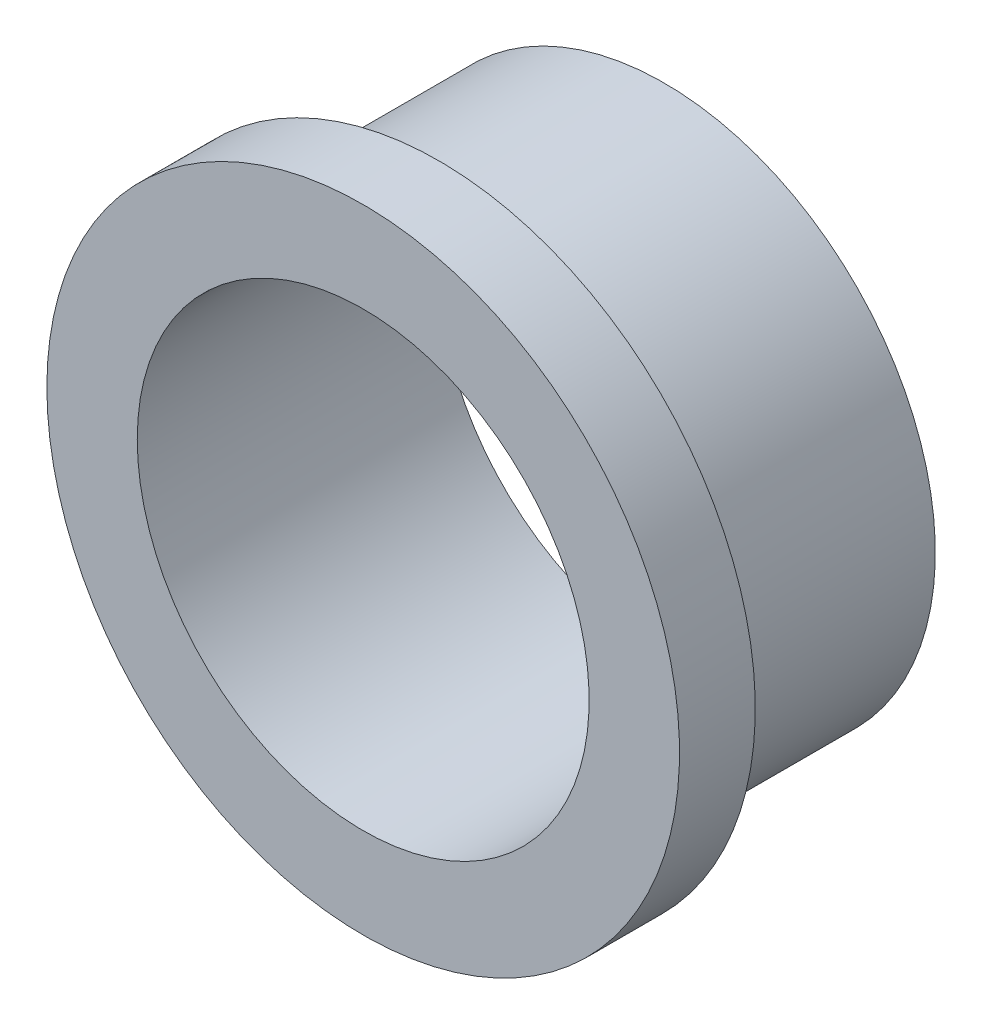
ISO-10303-21;
HEADER;
FILE_DESCRIPTION(('STEP AP214'),'2;1');
FILE_NAME('part.step','',(''),(''),'','','');
FILE_SCHEMA(('AUTOMOTIVE_DESIGN { 1 0 10303 214 1 1 1 1 }'));
ENDSEC;
DATA;
#1=APPLICATION_CONTEXT('core data for automotive mechanical design processes');
#2=APPLICATION_PROTOCOL_DEFINITION('international standard','automotive_design',2000,#1);
#3=PRODUCT_CONTEXT('',#1,'mechanical');
#4=PRODUCT('Part','Part','',(#3));
#5=PRODUCT_RELATED_PRODUCT_CATEGORY('part','',(#4));
#6=PRODUCT_DEFINITION_FORMATION('','',#4);
#7=PRODUCT_DEFINITION_CONTEXT('part definition',#1,'design');
#8=PRODUCT_DEFINITION('design','',#6,#7);
#9=PRODUCT_DEFINITION_SHAPE('','',#8);
#10=(LENGTH_UNIT() NAMED_UNIT(*) SI_UNIT(.MILLI.,.METRE.));
#11=(NAMED_UNIT(*) PLANE_ANGLE_UNIT() SI_UNIT($,.RADIAN.));
#12=(NAMED_UNIT(*) SI_UNIT($,.STERADIAN.) SOLID_ANGLE_UNIT());
#13=UNCERTAINTY_MEASURE_WITH_UNIT(LENGTH_MEASURE(1.E-05),#10,'distance_accuracy_value','');
#14=(GEOMETRIC_REPRESENTATION_CONTEXT(3) GLOBAL_UNCERTAINTY_ASSIGNED_CONTEXT((#13)) GLOBAL_UNIT_ASSIGNED_CONTEXT((#10,
#11,#12)) REPRESENTATION_CONTEXT('',''));
#15=CARTESIAN_POINT('',(0.,0.,0.));
#16=DIRECTION('',(0.,0.,1.));
#17=DIRECTION('',(1.,0.,0.));
#18=AXIS2_PLACEMENT_3D('',#15,#16,#17);
#19=CARTESIAN_POINT('',(0.,0.,0.));
#20=DIRECTION('',(0.,0.,-1.));
#21=DIRECTION('',(-1.,0.,0.));
#22=AXIS2_PLACEMENT_3D('',#19,#20,#21);
#23=CYLINDRICAL_SURFACE('',#22,3.5);
#24=CARTESIAN_POINT('',(0.,0.,-0.8382));
#25=DIRECTION('',(0.,0.,-1.));
#26=DIRECTION('',(-1.,0.,0.));
#27=AXIS2_PLACEMENT_3D('',#24,#25,#26);
#28=CIRCLE('',#27,3.5);
#29=CARTESIAN_POINT('',(-3.5,0.,-0.8382));
#30=VERTEX_POINT('',#29);
#31=EDGE_CURVE('E11',#30,#30,#28,.T.);
#32=ORIENTED_EDGE('',*,*,#31,.F.);
#33=EDGE_LOOP('',(#32));
#34=FACE_BOUND('',#33,.T.);
#35=CARTESIAN_POINT('',(0.,0.,0.));
#36=DIRECTION('',(0.,0.,-1.));
#37=DIRECTION('',(-1.,0.,0.));
#38=AXIS2_PLACEMENT_3D('',#35,#36,#37);
#39=CIRCLE('',#38,3.5);
#40=CARTESIAN_POINT('',(-3.5,0.,0.));
#41=VERTEX_POINT('',#40);
#42=EDGE_CURVE('E62',#41,#41,#39,.T.);
#43=ORIENTED_EDGE('',*,*,#42,.T.);
#44=EDGE_LOOP('',(#43));
#45=FACE_BOUND('',#44,.T.);
#46=ADVANCED_FACE('F17',(#34,#45),#23,.T.);
#47=CARTESIAN_POINT('',(0.,3.,-0.8382));
#48=DIRECTION('',(0.,0.,-1.));
#49=DIRECTION('',(0.,-1.,0.));
#50=AXIS2_PLACEMENT_3D('',#47,#48,#49);
#51=PLANE('',#50);
#52=CARTESIAN_POINT('',(0.,0.,-0.8382));
#53=DIRECTION('',(0.,0.,-1.));
#54=DIRECTION('',(-1.,0.,0.));
#55=AXIS2_PLACEMENT_3D('',#52,#53,#54);
#56=CIRCLE('',#55,3.);
#57=CARTESIAN_POINT('',(-3.,0.,-0.8382));
#58=VERTEX_POINT('',#57);
#59=EDGE_CURVE('E26',#58,#58,#56,.T.);
#60=ORIENTED_EDGE('',*,*,#59,.F.);
#61=EDGE_LOOP('',(#60));
#62=FACE_BOUND('',#61,.T.);
#63=ORIENTED_EDGE('',*,*,#31,.T.);
#64=EDGE_LOOP('',(#63));
#65=FACE_BOUND('',#64,.T.);
#66=ADVANCED_FACE('F131',(#62,#65),#51,.T.);
#67=CARTESIAN_POINT('',(0.,0.,0.));
#68=DIRECTION('',(0.,0.,-1.));
#69=DIRECTION('',(-1.,0.,0.));
#70=AXIS2_PLACEMENT_3D('',#67,#68,#69);
#71=CYLINDRICAL_SURFACE('',#70,3.);
#72=CARTESIAN_POINT('',(0.,0.,-3.33));
#73=DIRECTION('',(0.,0.,-1.));
#74=DIRECTION('',(-1.,0.,0.));
#75=AXIS2_PLACEMENT_3D('',#72,#73,#74);
#76=CIRCLE('',#75,3.);
#77=CARTESIAN_POINT('',(-3.,0.,-3.33));
#78=VERTEX_POINT('',#77);
#79=EDGE_CURVE('E71',#78,#78,#76,.T.);
#80=ORIENTED_EDGE('',*,*,#79,.F.);
#81=EDGE_LOOP('',(#80));
#82=FACE_BOUND('',#81,.T.);
#83=ORIENTED_EDGE('',*,*,#59,.T.);
#84=EDGE_LOOP('',(#83));
#85=FACE_BOUND('',#84,.T.);
#86=ADVANCED_FACE('F123',(#82,#85),#71,.T.);
#87=CARTESIAN_POINT('',(0.,2.5,-3.33));
#88=DIRECTION('',(0.,0.,-1.));
#89=DIRECTION('',(0.,-1.,0.));
#90=AXIS2_PLACEMENT_3D('',#87,#88,#89);
#91=PLANE('',#90);
#92=CARTESIAN_POINT('',(0.,0.,-3.33));
#93=DIRECTION('',(0.,0.,-1.));
#94=DIRECTION('',(-1.,0.,0.));
#95=AXIS2_PLACEMENT_3D('',#92,#93,#94);
#96=CIRCLE('',#95,2.5);
#97=CARTESIAN_POINT('',(-2.5,0.,-3.33));
#98=VERTEX_POINT('',#97);
#99=EDGE_CURVE('E67',#98,#98,#96,.T.);
#100=ORIENTED_EDGE('',*,*,#99,.F.);
#101=EDGE_LOOP('',(#100));
#102=FACE_BOUND('',#101,.T.);
#103=ORIENTED_EDGE('',*,*,#79,.T.);
#104=EDGE_LOOP('',(#103));
#105=FACE_BOUND('',#104,.T.);
#106=ADVANCED_FACE('F112',(#102,#105),#91,.T.);
#107=CARTESIAN_POINT('',(0.,0.,0.));
#108=DIRECTION('',(0.,0.,-1.));
#109=DIRECTION('',(-1.,0.,0.));
#110=AXIS2_PLACEMENT_3D('',#107,#108,#109);
#111=CYLINDRICAL_SURFACE('',#110,2.5);
#112=CARTESIAN_POINT('',(0.,0.,0.));
#113=DIRECTION('',(0.,0.,-1.));
#114=DIRECTION('',(-1.,0.,0.));
#115=AXIS2_PLACEMENT_3D('',#112,#113,#114);
#116=CIRCLE('',#115,2.5);
#117=CARTESIAN_POINT('',(-2.5,0.,0.));
#118=VERTEX_POINT('',#117);
#119=EDGE_CURVE('E55',#118,#118,#116,.T.);
#120=ORIENTED_EDGE('',*,*,#119,.F.);
#121=EDGE_LOOP('',(#120));
#122=FACE_BOUND('',#121,.T.);
#123=ORIENTED_EDGE('',*,*,#99,.T.);
#124=EDGE_LOOP('',(#123));
#125=FACE_BOUND('',#124,.T.);
#126=ADVANCED_FACE('F68',(#122,#125),#111,.F.);
#127=CARTESIAN_POINT('',(0.,3.5,0.));
#128=DIRECTION('',(0.,0.,1.));
#129=DIRECTION('',(1.,0.,0.));
#130=AXIS2_PLACEMENT_3D('',#127,#128,#129);
#131=PLANE('',#130);
#132=ORIENTED_EDGE('',*,*,#42,.F.);
#133=EDGE_LOOP('',(#132));
#134=FACE_BOUND('',#133,.T.);
#135=ORIENTED_EDGE('',*,*,#119,.T.);
#136=EDGE_LOOP('',(#135));
#137=FACE_BOUND('',#136,.T.);
#138=ADVANCED_FACE('F19',(#134,#137),#131,.T.);
#139=CLOSED_SHELL('',(#46,#66,#86,#106,#126,#138));
#140=MANIFOLD_SOLID_BREP('B1',#139);
#141=ADVANCED_BREP_SHAPE_REPRESENTATION('',(#18,#140),#14);
#142=SHAPE_DEFINITION_REPRESENTATION(#9,#141);
ENDSEC;
END-ISO-10303-21;
